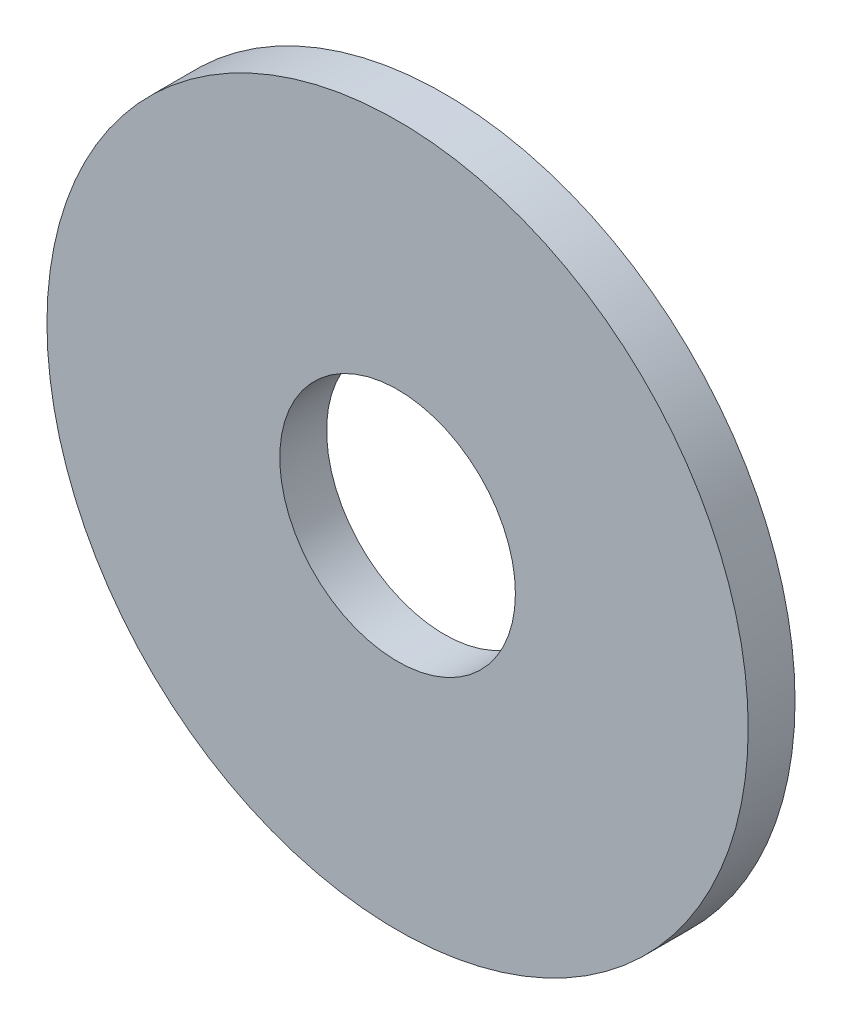
ISO-10303-21;
HEADER;
FILE_DESCRIPTION(('STEP AP214'),'2;1');
FILE_NAME('part.step','',(''),(''),'','','');
FILE_SCHEMA(('AUTOMOTIVE_DESIGN { 1 0 10303 214 1 1 1 1 }'));
ENDSEC;
DATA;
#1=APPLICATION_CONTEXT('core data for automotive mechanical design processes');
#2=APPLICATION_PROTOCOL_DEFINITION('international standard','automotive_design',2000,#1);
#3=PRODUCT_CONTEXT('',#1,'mechanical');
#4=PRODUCT('Part','Part','',(#3));
#5=PRODUCT_RELATED_PRODUCT_CATEGORY('part','',(#4));
#6=PRODUCT_DEFINITION_FORMATION('','',#4);
#7=PRODUCT_DEFINITION_CONTEXT('part definition',#1,'design');
#8=PRODUCT_DEFINITION('design','',#6,#7);
#9=PRODUCT_DEFINITION_SHAPE('','',#8);
#10=(LENGTH_UNIT() NAMED_UNIT(*) SI_UNIT(.MILLI.,.METRE.));
#11=(NAMED_UNIT(*) PLANE_ANGLE_UNIT() SI_UNIT($,.RADIAN.));
#12=(NAMED_UNIT(*) SI_UNIT($,.STERADIAN.) SOLID_ANGLE_UNIT());
#13=UNCERTAINTY_MEASURE_WITH_UNIT(LENGTH_MEASURE(1.E-05),#10,'distance_accuracy_value','');
#14=(GEOMETRIC_REPRESENTATION_CONTEXT(3) GLOBAL_UNCERTAINTY_ASSIGNED_CONTEXT((#13)) GLOBAL_UNIT_ASSIGNED_CONTEXT((#10,
#11,#12)) REPRESENTATION_CONTEXT('',''));
#15=CARTESIAN_POINT('',(0.,0.,0.));
#16=DIRECTION('',(0.,0.,1.));
#17=DIRECTION('',(1.,0.,0.));
#18=AXIS2_PLACEMENT_3D('',#15,#16,#17);
#19=CARTESIAN_POINT('',(0.,0.,2.));
#20=DIRECTION('',(0.,0.,1.));
#21=DIRECTION('',(1.,0.,0.));
#22=AXIS2_PLACEMENT_3D('',#19,#20,#21);
#23=PLANE('',#22);
#24=CARTESIAN_POINT('',(0.,0.,2.));
#25=DIRECTION('',(0.,0.,1.));
#26=DIRECTION('',(1.,0.,0.));
#27=AXIS2_PLACEMENT_3D('',#24,#25,#26);
#28=CIRCLE('',#27,14.97);
#29=CARTESIAN_POINT('',(14.97,0.,2.));
#30=VERTEX_POINT('',#29);
#31=EDGE_CURVE('E10',#30,#30,#28,.T.);
#32=ORIENTED_EDGE('',*,*,#31,.T.);
#33=EDGE_LOOP('',(#32));
#34=FACE_BOUND('',#33,.T.);
#35=CARTESIAN_POINT('',(0.,0.,2.));
#36=DIRECTION('',(0.,0.,1.));
#37=DIRECTION('',(1.,0.,0.));
#38=AXIS2_PLACEMENT_3D('',#35,#36,#37);
#39=CIRCLE('',#38,5.03);
#40=CARTESIAN_POINT('',(5.03,0.,2.));
#41=VERTEX_POINT('',#40);
#42=EDGE_CURVE('E46',#41,#41,#39,.T.);
#43=ORIENTED_EDGE('',*,*,#42,.F.);
#44=EDGE_LOOP('',(#43));
#45=FACE_BOUND('',#44,.T.);
#46=ADVANCED_FACE('F35',(#34,#45),#23,.T.);
#47=CARTESIAN_POINT('',(0.,0.,0.));
#48=DIRECTION('',(0.,0.,1.));
#49=DIRECTION('',(1.,0.,0.));
#50=AXIS2_PLACEMENT_3D('',#47,#48,#49);
#51=PLANE('',#50);
#52=CARTESIAN_POINT('',(0.,0.,0.));
#53=DIRECTION('',(0.,0.,1.));
#54=DIRECTION('',(1.,0.,0.));
#55=AXIS2_PLACEMENT_3D('',#52,#53,#54);
#56=CIRCLE('',#55,14.97);
#57=CARTESIAN_POINT('',(14.97,0.,0.));
#58=VERTEX_POINT('',#57);
#59=EDGE_CURVE('E39',#58,#58,#56,.T.);
#60=ORIENTED_EDGE('',*,*,#59,.F.);
#61=EDGE_LOOP('',(#60));
#62=FACE_BOUND('',#61,.T.);
#63=CARTESIAN_POINT('',(0.,0.,0.));
#64=DIRECTION('',(0.,0.,1.));
#65=DIRECTION('',(1.,0.,0.));
#66=AXIS2_PLACEMENT_3D('',#63,#64,#65);
#67=CIRCLE('',#66,5.03);
#68=CARTESIAN_POINT('',(5.03,0.,0.));
#69=VERTEX_POINT('',#68);
#70=EDGE_CURVE('E48',#69,#69,#67,.T.);
#71=ORIENTED_EDGE('',*,*,#70,.T.);
#72=EDGE_LOOP('',(#71));
#73=FACE_BOUND('',#72,.T.);
#74=ADVANCED_FACE('F58',(#62,#73),#51,.F.);
#75=CARTESIAN_POINT('',(0.,0.,2.));
#76=DIRECTION('',(0.,0.,-1.));
#77=DIRECTION('',(-1.,0.,0.));
#78=AXIS2_PLACEMENT_3D('',#75,#76,#77);
#79=CYLINDRICAL_SURFACE('',#78,14.97);
#80=ORIENTED_EDGE('',*,*,#31,.F.);
#81=EDGE_LOOP('',(#80));
#82=FACE_BOUND('',#81,.T.);
#83=ORIENTED_EDGE('',*,*,#59,.T.);
#84=EDGE_LOOP('',(#83));
#85=FACE_BOUND('',#84,.T.);
#86=ADVANCED_FACE('F37',(#82,#85),#79,.T.);
#87=CARTESIAN_POINT('',(0.,0.,2.));
#88=DIRECTION('',(0.,0.,-1.));
#89=DIRECTION('',(-1.,0.,0.));
#90=AXIS2_PLACEMENT_3D('',#87,#88,#89);
#91=CYLINDRICAL_SURFACE('',#90,5.03);
#92=ORIENTED_EDGE('',*,*,#42,.T.);
#93=EDGE_LOOP('',(#92));
#94=FACE_BOUND('',#93,.T.);
#95=ORIENTED_EDGE('',*,*,#70,.F.);
#96=EDGE_LOOP('',(#95));
#97=FACE_BOUND('',#96,.T.);
#98=ADVANCED_FACE('F54',(#94,#97),#91,.F.);
#99=CLOSED_SHELL('',(#46,#74,#86,#98));
#100=MANIFOLD_SOLID_BREP('B2',#99);
#101=ADVANCED_BREP_SHAPE_REPRESENTATION('',(#18,#100),#14);
#102=SHAPE_DEFINITION_REPRESENTATION(#9,#101);
ENDSEC;
END-ISO-10303-21;
